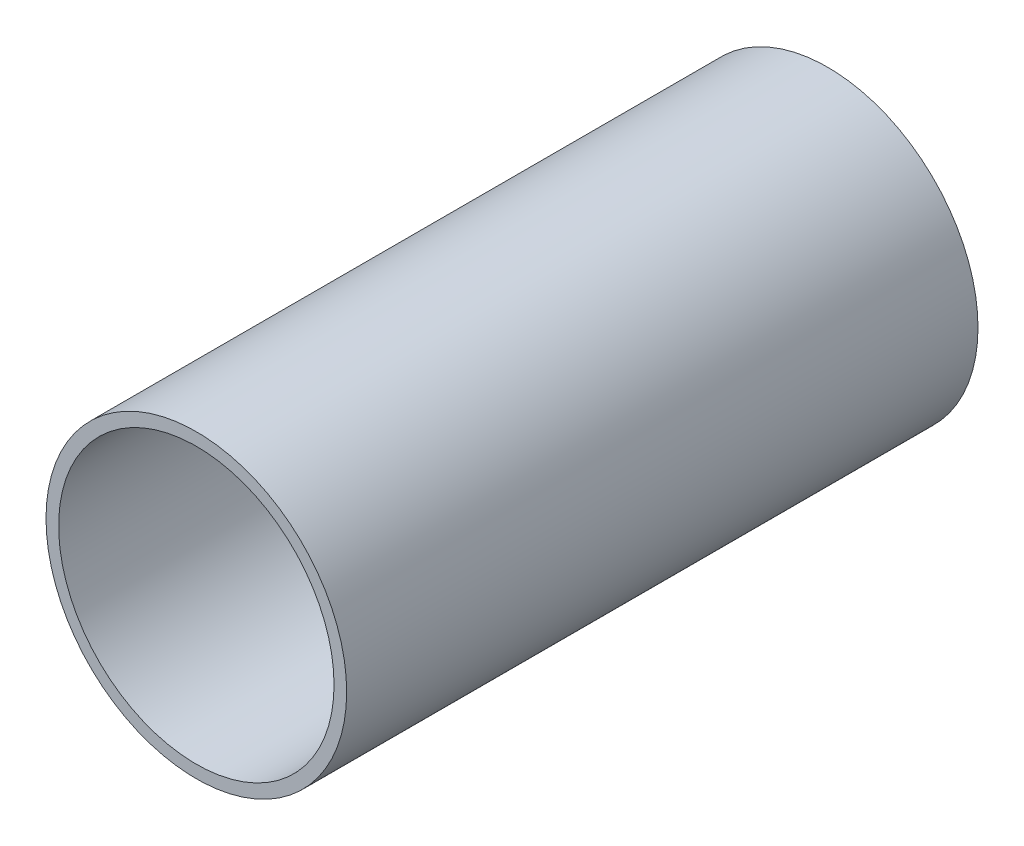
ISO-10303-21;
HEADER;
FILE_DESCRIPTION(('STEP AP214'),'2;1');
FILE_NAME('part.step','',(''),(''),'','','');
FILE_SCHEMA(('AUTOMOTIVE_DESIGN { 1 0 10303 214 1 1 1 1 }'));
ENDSEC;
DATA;
#1=APPLICATION_CONTEXT('core data for automotive mechanical design processes');
#2=APPLICATION_PROTOCOL_DEFINITION('international standard','automotive_design',2000,#1);
#3=PRODUCT_CONTEXT('',#1,'mechanical');
#4=PRODUCT('Part','Part','',(#3));
#5=PRODUCT_RELATED_PRODUCT_CATEGORY('part','',(#4));
#6=PRODUCT_DEFINITION_FORMATION('','',#4);
#7=PRODUCT_DEFINITION_CONTEXT('part definition',#1,'design');
#8=PRODUCT_DEFINITION('design','',#6,#7);
#9=PRODUCT_DEFINITION_SHAPE('','',#8);
#10=(LENGTH_UNIT() NAMED_UNIT(*) SI_UNIT(.MILLI.,.METRE.));
#11=(NAMED_UNIT(*) PLANE_ANGLE_UNIT() SI_UNIT($,.RADIAN.));
#12=(NAMED_UNIT(*) SI_UNIT($,.STERADIAN.) SOLID_ANGLE_UNIT());
#13=UNCERTAINTY_MEASURE_WITH_UNIT(LENGTH_MEASURE(1.E-05),#10,'distance_accuracy_value','');
#14=(GEOMETRIC_REPRESENTATION_CONTEXT(3) GLOBAL_UNCERTAINTY_ASSIGNED_CONTEXT((#13)) GLOBAL_UNIT_ASSIGNED_CONTEXT((#10,
#11,#12)) REPRESENTATION_CONTEXT('',''));
#15=CARTESIAN_POINT('',(0.,0.,0.));
#16=DIRECTION('',(0.,0.,1.));
#17=DIRECTION('',(1.,0.,0.));
#18=AXIS2_PLACEMENT_3D('',#15,#16,#17);
#19=CARTESIAN_POINT('',(0.,0.,80.));
#20=DIRECTION('',(0.,0.,1.));
#21=DIRECTION('',(1.,0.,0.));
#22=AXIS2_PLACEMENT_3D('',#19,#20,#21);
#23=PLANE('',#22);
#24=CARTESIAN_POINT('',(0.,0.,80.));
#25=DIRECTION('',(0.,0.,1.));
#26=DIRECTION('',(1.,0.,0.));
#27=AXIS2_PLACEMENT_3D('',#24,#25,#26);
#28=CIRCLE('',#27,19.05);
#29=CARTESIAN_POINT('',(19.05,0.,80.));
#30=VERTEX_POINT('',#29);
#31=EDGE_CURVE('E10',#30,#30,#28,.T.);
#32=ORIENTED_EDGE('',*,*,#31,.T.);
#33=EDGE_LOOP('',(#32));
#34=FACE_BOUND('',#33,.T.);
#35=CARTESIAN_POINT('',(0.,0.,80.));
#36=DIRECTION('',(0.,0.,1.));
#37=DIRECTION('',(1.,0.,0.));
#38=AXIS2_PLACEMENT_3D('',#35,#36,#37);
#39=CIRCLE('',#38,17.45);
#40=CARTESIAN_POINT('',(17.45,0.,80.));
#41=VERTEX_POINT('',#40);
#42=EDGE_CURVE('E46',#41,#41,#39,.T.);
#43=ORIENTED_EDGE('',*,*,#42,.F.);
#44=EDGE_LOOP('',(#43));
#45=FACE_BOUND('',#44,.T.);
#46=ADVANCED_FACE('F35',(#34,#45),#23,.T.);
#47=CARTESIAN_POINT('',(0.,0.,0.));
#48=DIRECTION('',(0.,0.,1.));
#49=DIRECTION('',(1.,0.,0.));
#50=AXIS2_PLACEMENT_3D('',#47,#48,#49);
#51=PLANE('',#50);
#52=CARTESIAN_POINT('',(0.,0.,0.));
#53=DIRECTION('',(0.,0.,1.));
#54=DIRECTION('',(1.,0.,0.));
#55=AXIS2_PLACEMENT_3D('',#52,#53,#54);
#56=CIRCLE('',#55,19.05);
#57=CARTESIAN_POINT('',(19.05,0.,0.));
#58=VERTEX_POINT('',#57);
#59=EDGE_CURVE('E39',#58,#58,#56,.T.);
#60=ORIENTED_EDGE('',*,*,#59,.F.);
#61=EDGE_LOOP('',(#60));
#62=FACE_BOUND('',#61,.T.);
#63=CARTESIAN_POINT('',(0.,0.,0.));
#64=DIRECTION('',(0.,0.,1.));
#65=DIRECTION('',(1.,0.,0.));
#66=AXIS2_PLACEMENT_3D('',#63,#64,#65);
#67=CIRCLE('',#66,17.45);
#68=CARTESIAN_POINT('',(17.45,0.,0.));
#69=VERTEX_POINT('',#68);
#70=EDGE_CURVE('E48',#69,#69,#67,.T.);
#71=ORIENTED_EDGE('',*,*,#70,.T.);
#72=EDGE_LOOP('',(#71));
#73=FACE_BOUND('',#72,.T.);
#74=ADVANCED_FACE('F58',(#62,#73),#51,.F.);
#75=CARTESIAN_POINT('',(0.,0.,80.));
#76=DIRECTION('',(0.,0.,-1.));
#77=DIRECTION('',(-1.,0.,0.));
#78=AXIS2_PLACEMENT_3D('',#75,#76,#77);
#79=CYLINDRICAL_SURFACE('',#78,19.05);
#80=ORIENTED_EDGE('',*,*,#31,.F.);
#81=EDGE_LOOP('',(#80));
#82=FACE_BOUND('',#81,.T.);
#83=ORIENTED_EDGE('',*,*,#59,.T.);
#84=EDGE_LOOP('',(#83));
#85=FACE_BOUND('',#84,.T.);
#86=ADVANCED_FACE('F37',(#82,#85),#79,.T.);
#87=CARTESIAN_POINT('',(0.,0.,80.));
#88=DIRECTION('',(0.,0.,-1.));
#89=DIRECTION('',(-1.,0.,0.));
#90=AXIS2_PLACEMENT_3D('',#87,#88,#89);
#91=CYLINDRICAL_SURFACE('',#90,17.45);
#92=ORIENTED_EDGE('',*,*,#42,.T.);
#93=EDGE_LOOP('',(#92));
#94=FACE_BOUND('',#93,.T.);
#95=ORIENTED_EDGE('',*,*,#70,.F.);
#96=EDGE_LOOP('',(#95));
#97=FACE_BOUND('',#96,.T.);
#98=ADVANCED_FACE('F54',(#94,#97),#91,.F.);
#99=CLOSED_SHELL('',(#46,#74,#86,#98));
#100=MANIFOLD_SOLID_BREP('B2',#99);
#101=ADVANCED_BREP_SHAPE_REPRESENTATION('',(#18,#100),#14);
#102=SHAPE_DEFINITION_REPRESENTATION(#9,#101);
ENDSEC;
END-ISO-10303-21;
